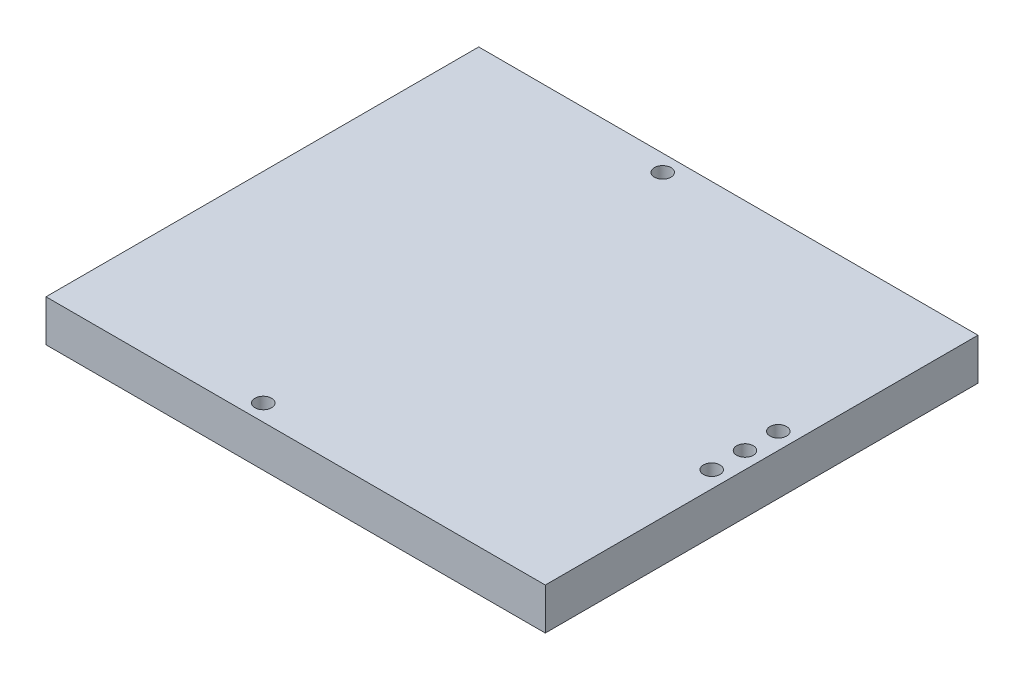
ISO-10303-21;
HEADER;
FILE_DESCRIPTION(('STEP AP214'),'2;1');
FILE_NAME('part.step','',(''),(''),'','','');
FILE_SCHEMA(('AUTOMOTIVE_DESIGN { 1 0 10303 214 1 1 1 1 }'));
ENDSEC;
DATA;
#1=APPLICATION_CONTEXT('core data for automotive mechanical design processes');
#2=APPLICATION_PROTOCOL_DEFINITION('international standard','automotive_design',2000,#1);
#3=PRODUCT_CONTEXT('',#1,'mechanical');
#4=PRODUCT('Part','Part','',(#3));
#5=PRODUCT_RELATED_PRODUCT_CATEGORY('part','',(#4));
#6=PRODUCT_DEFINITION_FORMATION('','',#4);
#7=PRODUCT_DEFINITION_CONTEXT('part definition',#1,'design');
#8=PRODUCT_DEFINITION('design','',#6,#7);
#9=PRODUCT_DEFINITION_SHAPE('','',#8);
#10=(LENGTH_UNIT() NAMED_UNIT(*) SI_UNIT(.MILLI.,.METRE.));
#11=(NAMED_UNIT(*) PLANE_ANGLE_UNIT() SI_UNIT($,.RADIAN.));
#12=(NAMED_UNIT(*) SI_UNIT($,.STERADIAN.) SOLID_ANGLE_UNIT());
#13=UNCERTAINTY_MEASURE_WITH_UNIT(LENGTH_MEASURE(1.E-05),#10,'distance_accuracy_value','');
#14=(GEOMETRIC_REPRESENTATION_CONTEXT(3) GLOBAL_UNCERTAINTY_ASSIGNED_CONTEXT((#13)) GLOBAL_UNIT_ASSIGNED_CONTEXT((#10,
#11,#12)) REPRESENTATION_CONTEXT('',''));
#15=CARTESIAN_POINT('',(0.,0.,0.));
#16=DIRECTION('',(0.,0.,1.));
#17=DIRECTION('',(1.,0.,0.));
#18=AXIS2_PLACEMENT_3D('',#15,#16,#17);
#19=CARTESIAN_POINT('',(0.,10.,0.));
#20=DIRECTION('',(0.,-1.,0.));
#21=DIRECTION('',(0.,0.,-1.));
#22=AXIS2_PLACEMENT_3D('',#19,#20,#21);
#23=PLANE('',#22);
#24=DIRECTION('',(0.,0.,1.));
#25=VECTOR('',#24,1.);
#26=CARTESIAN_POINT('',(0.,10.,0.));
#27=LINE('',#26,#25);
#28=CARTESIAN_POINT('',(0.,10.,-104.));
#29=VERTEX_POINT('',#28);
#30=CARTESIAN_POINT('',(0.,10.,0.));
#31=VERTEX_POINT('',#30);
#32=EDGE_CURVE('E92',#29,#31,#27,.T.);
#33=ORIENTED_EDGE('',*,*,#32,.T.);
#34=DIRECTION('',(1.,0.,0.));
#35=VECTOR('',#34,1.);
#36=CARTESIAN_POINT('',(0.,10.,0.));
#37=LINE('',#36,#35);
#38=CARTESIAN_POINT('',(120.,10.,0.));
#39=VERTEX_POINT('',#38);
#40=EDGE_CURVE('E87',#31,#39,#37,.T.);
#41=ORIENTED_EDGE('',*,*,#40,.T.);
#42=DIRECTION('',(0.,0.,-1.));
#43=VECTOR('',#42,1.);
#44=CARTESIAN_POINT('',(120.,10.,0.));
#45=LINE('',#44,#43);
#46=CARTESIAN_POINT('',(120.,10.,-104.));
#47=VERTEX_POINT('',#46);
#48=EDGE_CURVE('E90',#39,#47,#45,.T.);
#49=ORIENTED_EDGE('',*,*,#48,.T.);
#50=DIRECTION('',(-1.,0.,0.));
#51=VECTOR('',#50,1.);
#52=CARTESIAN_POINT('',(0.,10.,-104.));
#53=LINE('',#52,#51);
#54=EDGE_CURVE('E57',#47,#29,#53,.T.);
#55=ORIENTED_EDGE('',*,*,#54,.T.);
#56=EDGE_LOOP('',(#33,#41,#49,#55));
#57=FACE_BOUND('',#56,.T.);
#58=CARTESIAN_POINT('',(116.,10.,-52.));
#59=DIRECTION('',(0.,1.,0.));
#60=DIRECTION('',(0.,0.,1.));
#61=AXIS2_PLACEMENT_3D('',#58,#59,#60);
#62=CIRCLE('',#61,2.);
#63=CARTESIAN_POINT('',(116.,10.,-50.));
#64=VERTEX_POINT('',#63);
#65=EDGE_CURVE('E112',#64,#64,#62,.T.);
#66=ORIENTED_EDGE('',*,*,#65,.F.);
#67=EDGE_LOOP('',(#66));
#68=FACE_BOUND('',#67,.T.);
#69=CARTESIAN_POINT('',(116.,10.,-60.));
#70=DIRECTION('',(0.,1.,0.));
#71=DIRECTION('',(0.,0.,1.));
#72=AXIS2_PLACEMENT_3D('',#69,#70,#71);
#73=CIRCLE('',#72,2.);
#74=CARTESIAN_POINT('',(116.,10.,-58.));
#75=VERTEX_POINT('',#74);
#76=EDGE_CURVE('E134',#75,#75,#73,.T.);
#77=ORIENTED_EDGE('',*,*,#76,.F.);
#78=EDGE_LOOP('',(#77));
#79=FACE_BOUND('',#78,.T.);
#80=CARTESIAN_POINT('',(116.,10.,-44.));
#81=DIRECTION('',(0.,1.,0.));
#82=DIRECTION('',(0.,0.,-1.));
#83=AXIS2_PLACEMENT_3D('',#80,#81,#82);
#84=CIRCLE('',#83,2.);
#85=CARTESIAN_POINT('',(116.,10.,-46.));
#86=VERTEX_POINT('',#85);
#87=EDGE_CURVE('E142',#86,#86,#84,.T.);
#88=ORIENTED_EDGE('',*,*,#87,.F.);
#89=EDGE_LOOP('',(#88));
#90=FACE_BOUND('',#89,.T.);
#91=CARTESIAN_POINT('',(48.2232340694836,10.,-4.));
#92=DIRECTION('',(0.,1.,0.));
#93=DIRECTION('',(0.,0.,1.));
#94=AXIS2_PLACEMENT_3D('',#91,#92,#93);
#95=CIRCLE('',#94,2.);
#96=CARTESIAN_POINT('',(48.2232340694836,10.,-2.00000000000001));
#97=VERTEX_POINT('',#96);
#98=EDGE_CURVE('E150',#97,#97,#95,.T.);
#99=ORIENTED_EDGE('',*,*,#98,.F.);
#100=EDGE_LOOP('',(#99));
#101=FACE_BOUND('',#100,.T.);
#102=CARTESIAN_POINT('',(48.2232340694836,10.,-100.));
#103=DIRECTION('',(0.,1.,0.));
#104=DIRECTION('',(0.,0.,-1.));
#105=AXIS2_PLACEMENT_3D('',#102,#103,#104);
#106=CIRCLE('',#105,2.);
#107=CARTESIAN_POINT('',(48.2232340694836,10.,-102.));
#108=VERTEX_POINT('',#107);
#109=EDGE_CURVE('E158',#108,#108,#106,.T.);
#110=ORIENTED_EDGE('',*,*,#109,.F.);
#111=EDGE_LOOP('',(#110));
#112=FACE_BOUND('',#111,.T.);
#113=ADVANCED_FACE('F39',(#57,#68,#79,#90,#101,#112),#23,.F.);
#114=CARTESIAN_POINT('',(0.,0.,0.));
#115=DIRECTION('',(0.,-1.,0.));
#116=DIRECTION('',(0.,0.,-1.));
#117=AXIS2_PLACEMENT_3D('',#114,#115,#116);
#118=PLANE('',#117);
#119=CARTESIAN_POINT('',(48.2232340694836,0.,-4.));
#120=DIRECTION('',(0.,1.,0.));
#121=DIRECTION('',(0.,0.,1.));
#122=AXIS2_PLACEMENT_3D('',#119,#120,#121);
#123=CIRCLE('',#122,2.);
#124=CARTESIAN_POINT('',(48.2232340694836,0.,-2.00000000000001));
#125=VERTEX_POINT('',#124);
#126=EDGE_CURVE('E154',#125,#125,#123,.T.);
#127=ORIENTED_EDGE('',*,*,#126,.T.);
#128=EDGE_LOOP('',(#127));
#129=FACE_BOUND('',#128,.T.);
#130=CARTESIAN_POINT('',(116.,0.,-60.));
#131=DIRECTION('',(0.,1.,0.));
#132=DIRECTION('',(0.,0.,1.));
#133=AXIS2_PLACEMENT_3D('',#130,#131,#132);
#134=CIRCLE('',#133,2.);
#135=CARTESIAN_POINT('',(116.,0.,-58.));
#136=VERTEX_POINT('',#135);
#137=EDGE_CURVE('E138',#136,#136,#134,.T.);
#138=ORIENTED_EDGE('',*,*,#137,.T.);
#139=EDGE_LOOP('',(#138));
#140=FACE_BOUND('',#139,.T.);
#141=DIRECTION('',(0.,0.,1.));
#142=VECTOR('',#141,1.);
#143=CARTESIAN_POINT('',(0.,0.,0.));
#144=LINE('',#143,#142);
#145=CARTESIAN_POINT('',(0.,0.,-104.));
#146=VERTEX_POINT('',#145);
#147=CARTESIAN_POINT('',(0.,0.,0.));
#148=VERTEX_POINT('',#147);
#149=EDGE_CURVE('E108',#146,#148,#144,.T.);
#150=ORIENTED_EDGE('',*,*,#149,.F.);
#151=DIRECTION('',(-1.,0.,0.));
#152=VECTOR('',#151,1.);
#153=CARTESIAN_POINT('',(0.,0.,-104.));
#154=LINE('',#153,#152);
#155=CARTESIAN_POINT('',(120.,0.,-104.));
#156=VERTEX_POINT('',#155);
#157=EDGE_CURVE('E80',#156,#146,#154,.T.);
#158=ORIENTED_EDGE('',*,*,#157,.F.);
#159=DIRECTION('',(0.,0.,-1.));
#160=VECTOR('',#159,1.);
#161=CARTESIAN_POINT('',(120.,0.,0.));
#162=LINE('',#161,#160);
#163=CARTESIAN_POINT('',(120.,0.,0.));
#164=VERTEX_POINT('',#163);
#165=EDGE_CURVE('E74',#164,#156,#162,.T.);
#166=ORIENTED_EDGE('',*,*,#165,.F.);
#167=DIRECTION('',(1.,0.,0.));
#168=VECTOR('',#167,1.);
#169=CARTESIAN_POINT('',(0.,0.,0.));
#170=LINE('',#169,#168);
#171=EDGE_CURVE('E97',#148,#164,#170,.T.);
#172=ORIENTED_EDGE('',*,*,#171,.F.);
#173=EDGE_LOOP('',(#150,#158,#166,#172));
#174=FACE_BOUND('',#173,.T.);
#175=CARTESIAN_POINT('',(116.,0.,-52.));
#176=DIRECTION('',(0.,1.,0.));
#177=DIRECTION('',(0.,0.,1.));
#178=AXIS2_PLACEMENT_3D('',#175,#176,#177);
#179=CIRCLE('',#178,2.);
#180=CARTESIAN_POINT('',(116.,0.,-50.));
#181=VERTEX_POINT('',#180);
#182=EDGE_CURVE('E130',#181,#181,#179,.T.);
#183=ORIENTED_EDGE('',*,*,#182,.T.);
#184=EDGE_LOOP('',(#183));
#185=FACE_BOUND('',#184,.T.);
#186=CARTESIAN_POINT('',(116.,0.,-44.));
#187=DIRECTION('',(0.,1.,0.));
#188=DIRECTION('',(0.,0.,-1.));
#189=AXIS2_PLACEMENT_3D('',#186,#187,#188);
#190=CIRCLE('',#189,2.);
#191=CARTESIAN_POINT('',(116.,0.,-46.));
#192=VERTEX_POINT('',#191);
#193=EDGE_CURVE('E146',#192,#192,#190,.T.);
#194=ORIENTED_EDGE('',*,*,#193,.T.);
#195=EDGE_LOOP('',(#194));
#196=FACE_BOUND('',#195,.T.);
#197=CARTESIAN_POINT('',(48.2232340694836,0.,-100.));
#198=DIRECTION('',(0.,1.,0.));
#199=DIRECTION('',(0.,0.,-1.));
#200=AXIS2_PLACEMENT_3D('',#197,#198,#199);
#201=CIRCLE('',#200,2.);
#202=CARTESIAN_POINT('',(48.2232340694836,0.,-102.));
#203=VERTEX_POINT('',#202);
#204=EDGE_CURVE('E162',#203,#203,#201,.T.);
#205=ORIENTED_EDGE('',*,*,#204,.T.);
#206=EDGE_LOOP('',(#205));
#207=FACE_BOUND('',#206,.T.);
#208=ADVANCED_FACE('F125',(#129,#140,#174,#185,#196,#207),#118,.T.);
#209=CARTESIAN_POINT('',(0.,10.,0.));
#210=DIRECTION('',(1.,0.,0.));
#211=DIRECTION('',(0.,0.,-1.));
#212=AXIS2_PLACEMENT_3D('',#209,#210,#211);
#213=PLANE('',#212);
#214=ORIENTED_EDGE('',*,*,#149,.T.);
#215=DIRECTION('',(0.,-1.,0.));
#216=VECTOR('',#215,1.);
#217=CARTESIAN_POINT('',(0.,10.,0.));
#218=LINE('',#217,#216);
#219=EDGE_CURVE('E11',#31,#148,#218,.T.);
#220=ORIENTED_EDGE('',*,*,#219,.F.);
#221=ORIENTED_EDGE('',*,*,#32,.F.);
#222=DIRECTION('',(0.,-1.,0.));
#223=VECTOR('',#222,1.);
#224=CARTESIAN_POINT('',(0.,10.,-104.));
#225=LINE('',#224,#223);
#226=EDGE_CURVE('E104',#29,#146,#225,.T.);
#227=ORIENTED_EDGE('',*,*,#226,.T.);
#228=EDGE_LOOP('',(#214,#220,#221,#227));
#229=FACE_BOUND('',#228,.T.);
#230=ADVANCED_FACE('F41',(#229),#213,.F.);
#231=CARTESIAN_POINT('',(0.,10.,0.));
#232=DIRECTION('',(0.,0.,-1.));
#233=DIRECTION('',(-1.,0.,0.));
#234=AXIS2_PLACEMENT_3D('',#231,#232,#233);
#235=PLANE('',#234);
#236=ORIENTED_EDGE('',*,*,#171,.T.);
#237=DIRECTION('',(0.,-1.,0.));
#238=VECTOR('',#237,1.);
#239=CARTESIAN_POINT('',(120.,10.,0.));
#240=LINE('',#239,#238);
#241=EDGE_CURVE('E49',#39,#164,#240,.T.);
#242=ORIENTED_EDGE('',*,*,#241,.F.);
#243=ORIENTED_EDGE('',*,*,#40,.F.);
#244=ORIENTED_EDGE('',*,*,#219,.T.);
#245=EDGE_LOOP('',(#236,#242,#243,#244));
#246=FACE_BOUND('',#245,.T.);
#247=ADVANCED_FACE('F96',(#246),#235,.F.);
#248=CARTESIAN_POINT('',(120.,10.,0.));
#249=DIRECTION('',(-1.,0.,0.));
#250=DIRECTION('',(0.,0.,1.));
#251=AXIS2_PLACEMENT_3D('',#248,#249,#250);
#252=PLANE('',#251);
#253=ORIENTED_EDGE('',*,*,#165,.T.);
#254=DIRECTION('',(0.,-1.,0.));
#255=VECTOR('',#254,1.);
#256=CARTESIAN_POINT('',(120.,10.,-104.));
#257=LINE('',#256,#255);
#258=EDGE_CURVE('E99',#47,#156,#257,.T.);
#259=ORIENTED_EDGE('',*,*,#258,.F.);
#260=ORIENTED_EDGE('',*,*,#48,.F.);
#261=ORIENTED_EDGE('',*,*,#241,.T.);
#262=EDGE_LOOP('',(#253,#259,#260,#261));
#263=FACE_BOUND('',#262,.T.);
#264=ADVANCED_FACE('F100',(#263),#252,.F.);
#265=CARTESIAN_POINT('',(0.,10.,-104.));
#266=DIRECTION('',(0.,0.,1.));
#267=DIRECTION('',(1.,0.,0.));
#268=AXIS2_PLACEMENT_3D('',#265,#266,#267);
#269=PLANE('',#268);
#270=ORIENTED_EDGE('',*,*,#157,.T.);
#271=ORIENTED_EDGE('',*,*,#226,.F.);
#272=ORIENTED_EDGE('',*,*,#54,.F.);
#273=ORIENTED_EDGE('',*,*,#258,.T.);
#274=EDGE_LOOP('',(#270,#271,#272,#273));
#275=FACE_BOUND('',#274,.T.);
#276=ADVANCED_FACE('F122',(#275),#269,.F.);
#277=CARTESIAN_POINT('',(116.,10.,-52.));
#278=DIRECTION('',(0.,-1.,0.));
#279=DIRECTION('',(0.,0.,-1.));
#280=AXIS2_PLACEMENT_3D('',#277,#278,#279);
#281=CYLINDRICAL_SURFACE('',#280,2.);
#282=ORIENTED_EDGE('',*,*,#65,.T.);
#283=EDGE_LOOP('',(#282));
#284=FACE_BOUND('',#283,.T.);
#285=ORIENTED_EDGE('',*,*,#182,.F.);
#286=EDGE_LOOP('',(#285));
#287=FACE_BOUND('',#286,.T.);
#288=ADVANCED_FACE('F181',(#284,#287),#281,.F.);
#289=CARTESIAN_POINT('',(116.,10.,-60.));
#290=DIRECTION('',(0.,-1.,0.));
#291=DIRECTION('',(0.,0.,-1.));
#292=AXIS2_PLACEMENT_3D('',#289,#290,#291);
#293=CYLINDRICAL_SURFACE('',#292,2.);
#294=ORIENTED_EDGE('',*,*,#76,.T.);
#295=EDGE_LOOP('',(#294));
#296=FACE_BOUND('',#295,.T.);
#297=ORIENTED_EDGE('',*,*,#137,.F.);
#298=EDGE_LOOP('',(#297));
#299=FACE_BOUND('',#298,.T.);
#300=ADVANCED_FACE('F227',(#296,#299),#293,.F.);
#301=CARTESIAN_POINT('',(116.,10.,-44.));
#302=DIRECTION('',(0.,-1.,0.));
#303=DIRECTION('',(0.,0.,-1.));
#304=AXIS2_PLACEMENT_3D('',#301,#302,#303);
#305=CYLINDRICAL_SURFACE('',#304,2.);
#306=ORIENTED_EDGE('',*,*,#87,.T.);
#307=EDGE_LOOP('',(#306));
#308=FACE_BOUND('',#307,.T.);
#309=ORIENTED_EDGE('',*,*,#193,.F.);
#310=EDGE_LOOP('',(#309));
#311=FACE_BOUND('',#310,.T.);
#312=ADVANCED_FACE('F235',(#308,#311),#305,.F.);
#313=CARTESIAN_POINT('',(48.2232340694836,10.,-4.));
#314=DIRECTION('',(0.,-1.,0.));
#315=DIRECTION('',(0.,0.,-1.));
#316=AXIS2_PLACEMENT_3D('',#313,#314,#315);
#317=CYLINDRICAL_SURFACE('',#316,2.);
#318=ORIENTED_EDGE('',*,*,#98,.T.);
#319=EDGE_LOOP('',(#318));
#320=FACE_BOUND('',#319,.T.);
#321=ORIENTED_EDGE('',*,*,#126,.F.);
#322=EDGE_LOOP('',(#321));
#323=FACE_BOUND('',#322,.T.);
#324=ADVANCED_FACE('F243',(#320,#323),#317,.F.);
#325=CARTESIAN_POINT('',(48.2232340694836,10.,-100.));
#326=DIRECTION('',(0.,-1.,0.));
#327=DIRECTION('',(0.,0.,-1.));
#328=AXIS2_PLACEMENT_3D('',#325,#326,#327);
#329=CYLINDRICAL_SURFACE('',#328,2.);
#330=ORIENTED_EDGE('',*,*,#109,.T.);
#331=EDGE_LOOP('',(#330));
#332=FACE_BOUND('',#331,.T.);
#333=ORIENTED_EDGE('',*,*,#204,.F.);
#334=EDGE_LOOP('',(#333));
#335=FACE_BOUND('',#334,.T.);
#336=ADVANCED_FACE('F170',(#332,#335),#329,.F.);
#337=CLOSED_SHELL('',(#113,#208,#230,#247,#264,#276,#288,#300,#312,#324,#336));
#338=MANIFOLD_SOLID_BREP('B2',#337);
#339=ADVANCED_BREP_SHAPE_REPRESENTATION('',(#18,#338),#14);
#340=SHAPE_DEFINITION_REPRESENTATION(#9,#339);
ENDSEC;
END-ISO-10303-21;
